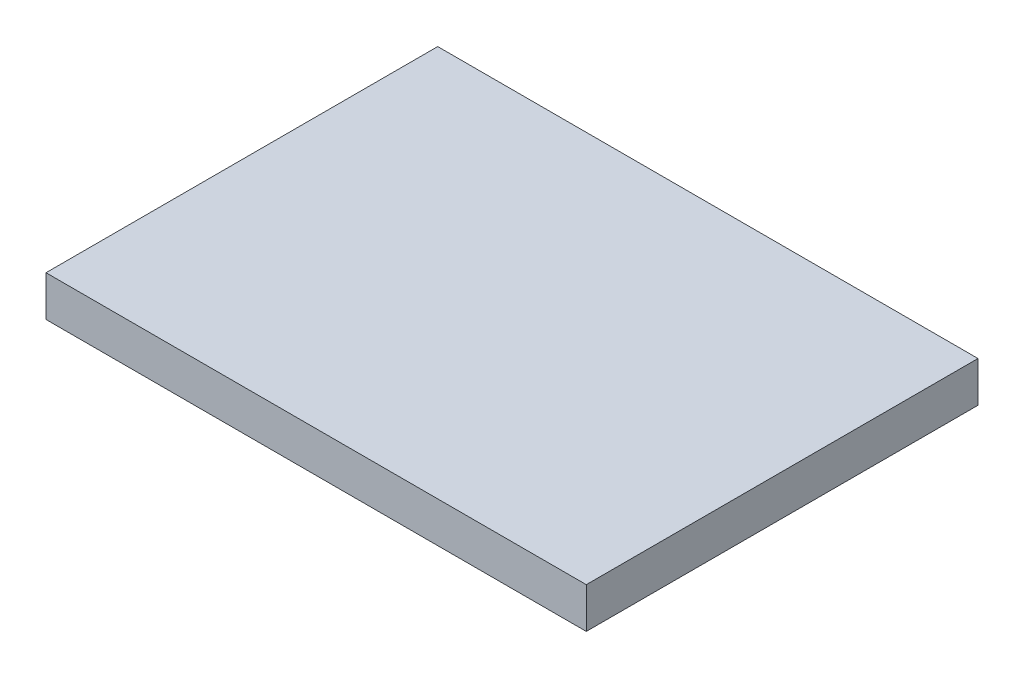
ISO-10303-21;
HEADER;
FILE_DESCRIPTION(('STEP AP214'),'2;1');
FILE_NAME('part.step','',(''),(''),'','','');
FILE_SCHEMA(('AUTOMOTIVE_DESIGN { 1 0 10303 214 1 1 1 1 }'));
ENDSEC;
DATA;
#1=APPLICATION_CONTEXT('core data for automotive mechanical design processes');
#2=APPLICATION_PROTOCOL_DEFINITION('international standard','automotive_design',2000,#1);
#3=PRODUCT_CONTEXT('',#1,'mechanical');
#4=PRODUCT('Part','Part','',(#3));
#5=PRODUCT_RELATED_PRODUCT_CATEGORY('part','',(#4));
#6=PRODUCT_DEFINITION_FORMATION('','',#4);
#7=PRODUCT_DEFINITION_CONTEXT('part definition',#1,'design');
#8=PRODUCT_DEFINITION('design','',#6,#7);
#9=PRODUCT_DEFINITION_SHAPE('','',#8);
#10=(LENGTH_UNIT() NAMED_UNIT(*) SI_UNIT(.MILLI.,.METRE.));
#11=(NAMED_UNIT(*) PLANE_ANGLE_UNIT() SI_UNIT($,.RADIAN.));
#12=(NAMED_UNIT(*) SI_UNIT($,.STERADIAN.) SOLID_ANGLE_UNIT());
#13=UNCERTAINTY_MEASURE_WITH_UNIT(LENGTH_MEASURE(1.E-05),#10,'distance_accuracy_value','');
#14=(GEOMETRIC_REPRESENTATION_CONTEXT(3) GLOBAL_UNCERTAINTY_ASSIGNED_CONTEXT((#13)) GLOBAL_UNIT_ASSIGNED_CONTEXT((#10,
#11,#12)) REPRESENTATION_CONTEXT('',''));
#15=CARTESIAN_POINT('',(0.,0.,0.));
#16=DIRECTION('',(0.,0.,1.));
#17=DIRECTION('',(1.,0.,0.));
#18=AXIS2_PLACEMENT_3D('',#15,#16,#17);
#19=CARTESIAN_POINT('',(-40.,6.,-29.));
#20=DIRECTION('',(0.,0.,-1.));
#21=DIRECTION('',(-1.,0.,0.));
#22=AXIS2_PLACEMENT_3D('',#19,#20,#21);
#23=PLANE('',#22);
#24=DIRECTION('',(1.,0.,0.));
#25=VECTOR('',#24,1.);
#26=CARTESIAN_POINT('',(-40.,0.,-29.));
#27=LINE('',#26,#25);
#28=CARTESIAN_POINT('',(-40.,0.,-29.));
#29=VERTEX_POINT('',#28);
#30=CARTESIAN_POINT('',(40.,0.,-29.));
#31=VERTEX_POINT('',#30);
#32=EDGE_CURVE('E101',#29,#31,#27,.T.);
#33=ORIENTED_EDGE('',*,*,#32,.F.);
#34=DIRECTION('',(0.,-1.,0.));
#35=VECTOR('',#34,1.);
#36=CARTESIAN_POINT('',(-40.,6.,-29.));
#37=LINE('',#36,#35);
#38=CARTESIAN_POINT('',(-40.,6.,-29.));
#39=VERTEX_POINT('',#38);
#40=EDGE_CURVE('E11',#39,#29,#37,.T.);
#41=ORIENTED_EDGE('',*,*,#40,.F.);
#42=DIRECTION('',(1.,0.,0.));
#43=VECTOR('',#42,1.);
#44=CARTESIAN_POINT('',(-40.,6.,-29.));
#45=LINE('',#44,#43);
#46=CARTESIAN_POINT('',(40.,6.,-29.));
#47=VERTEX_POINT('',#46);
#48=EDGE_CURVE('E96',#39,#47,#45,.T.);
#49=ORIENTED_EDGE('',*,*,#48,.T.);
#50=DIRECTION('',(0.,-1.,0.));
#51=VECTOR('',#50,1.);
#52=CARTESIAN_POINT('',(40.,6.,-29.));
#53=LINE('',#52,#51);
#54=EDGE_CURVE('E39',#47,#31,#53,.T.);
#55=ORIENTED_EDGE('',*,*,#54,.T.);
#56=EDGE_LOOP('',(#33,#41,#49,#55));
#57=FACE_BOUND('',#56,.T.);
#58=ADVANCED_FACE('F36',(#57),#23,.T.);
#59=CARTESIAN_POINT('',(-40.,6.,-29.));
#60=DIRECTION('',(1.,0.,0.));
#61=DIRECTION('',(0.,0.,-1.));
#62=AXIS2_PLACEMENT_3D('',#59,#60,#61);
#63=PLANE('',#62);
#64=DIRECTION('',(0.,0.,1.));
#65=VECTOR('',#64,1.);
#66=CARTESIAN_POINT('',(-40.,0.,-29.));
#67=LINE('',#66,#65);
#68=CARTESIAN_POINT('',(-40.,0.,29.));
#69=VERTEX_POINT('',#68);
#70=EDGE_CURVE('E69',#29,#69,#67,.T.);
#71=ORIENTED_EDGE('',*,*,#70,.T.);
#72=DIRECTION('',(0.,-1.,0.));
#73=VECTOR('',#72,1.);
#74=CARTESIAN_POINT('',(-40.,6.,29.));
#75=LINE('',#74,#73);
#76=CARTESIAN_POINT('',(-40.,6.,29.));
#77=VERTEX_POINT('',#76);
#78=EDGE_CURVE('E45',#77,#69,#75,.T.);
#79=ORIENTED_EDGE('',*,*,#78,.F.);
#80=DIRECTION('',(0.,0.,1.));
#81=VECTOR('',#80,1.);
#82=CARTESIAN_POINT('',(-40.,6.,-29.));
#83=LINE('',#82,#81);
#84=EDGE_CURVE('E86',#39,#77,#83,.T.);
#85=ORIENTED_EDGE('',*,*,#84,.F.);
#86=ORIENTED_EDGE('',*,*,#40,.T.);
#87=EDGE_LOOP('',(#71,#79,#85,#86));
#88=FACE_BOUND('',#87,.T.);
#89=ADVANCED_FACE('F111',(#88),#63,.F.);
#90=CARTESIAN_POINT('',(-40.,6.,29.));
#91=DIRECTION('',(0.,0.,-1.));
#92=DIRECTION('',(-1.,0.,0.));
#93=AXIS2_PLACEMENT_3D('',#90,#91,#92);
#94=PLANE('',#93);
#95=DIRECTION('',(1.,0.,0.));
#96=VECTOR('',#95,1.);
#97=CARTESIAN_POINT('',(-40.,0.,29.));
#98=LINE('',#97,#96);
#99=CARTESIAN_POINT('',(40.,0.,29.));
#100=VERTEX_POINT('',#99);
#101=EDGE_CURVE('E93',#69,#100,#98,.T.);
#102=ORIENTED_EDGE('',*,*,#101,.T.);
#103=DIRECTION('',(0.,-1.,0.));
#104=VECTOR('',#103,1.);
#105=CARTESIAN_POINT('',(40.,6.,29.));
#106=LINE('',#105,#104);
#107=CARTESIAN_POINT('',(40.,6.,29.));
#108=VERTEX_POINT('',#107);
#109=EDGE_CURVE('E90',#108,#100,#106,.T.);
#110=ORIENTED_EDGE('',*,*,#109,.F.);
#111=DIRECTION('',(1.,0.,0.));
#112=VECTOR('',#111,1.);
#113=CARTESIAN_POINT('',(-40.,6.,29.));
#114=LINE('',#113,#112);
#115=EDGE_CURVE('E81',#77,#108,#114,.T.);
#116=ORIENTED_EDGE('',*,*,#115,.F.);
#117=ORIENTED_EDGE('',*,*,#78,.T.);
#118=EDGE_LOOP('',(#102,#110,#116,#117));
#119=FACE_BOUND('',#118,.T.);
#120=ADVANCED_FACE('F91',(#119),#94,.F.);
#121=CARTESIAN_POINT('',(40.,6.,-29.));
#122=DIRECTION('',(1.,0.,0.));
#123=DIRECTION('',(0.,0.,-1.));
#124=AXIS2_PLACEMENT_3D('',#121,#122,#123);
#125=PLANE('',#124);
#126=DIRECTION('',(0.,0.,1.));
#127=VECTOR('',#126,1.);
#128=CARTESIAN_POINT('',(40.,0.,-29.));
#129=LINE('',#128,#127);
#130=EDGE_CURVE('E104',#31,#100,#129,.T.);
#131=ORIENTED_EDGE('',*,*,#130,.F.);
#132=ORIENTED_EDGE('',*,*,#54,.F.);
#133=DIRECTION('',(0.,0.,1.));
#134=VECTOR('',#133,1.);
#135=CARTESIAN_POINT('',(40.,6.,-29.));
#136=LINE('',#135,#134);
#137=EDGE_CURVE('E85',#47,#108,#136,.T.);
#138=ORIENTED_EDGE('',*,*,#137,.T.);
#139=ORIENTED_EDGE('',*,*,#109,.T.);
#140=EDGE_LOOP('',(#131,#132,#138,#139));
#141=FACE_BOUND('',#140,.T.);
#142=ADVANCED_FACE('F95',(#141),#125,.T.);
#143=CARTESIAN_POINT('',(0.,6.,0.));
#144=DIRECTION('',(0.,-1.,0.));
#145=DIRECTION('',(0.,0.,-1.));
#146=AXIS2_PLACEMENT_3D('',#143,#144,#145);
#147=PLANE('',#146);
#148=ORIENTED_EDGE('',*,*,#48,.F.);
#149=ORIENTED_EDGE('',*,*,#84,.T.);
#150=ORIENTED_EDGE('',*,*,#115,.T.);
#151=ORIENTED_EDGE('',*,*,#137,.F.);
#152=EDGE_LOOP('',(#148,#149,#150,#151));
#153=FACE_BOUND('',#152,.T.);
#154=ADVANCED_FACE('F84',(#153),#147,.F.);
#155=CARTESIAN_POINT('',(0.,0.,0.));
#156=DIRECTION('',(0.,-1.,0.));
#157=DIRECTION('',(0.,0.,-1.));
#158=AXIS2_PLACEMENT_3D('',#155,#156,#157);
#159=PLANE('',#158);
#160=ORIENTED_EDGE('',*,*,#32,.T.);
#161=ORIENTED_EDGE('',*,*,#130,.T.);
#162=ORIENTED_EDGE('',*,*,#101,.F.);
#163=ORIENTED_EDGE('',*,*,#70,.F.);
#164=EDGE_LOOP('',(#160,#161,#162,#163));
#165=FACE_BOUND('',#164,.T.);
#166=ADVANCED_FACE('F109',(#165),#159,.T.);
#167=CLOSED_SHELL('',(#58,#89,#120,#142,#154,#166));
#168=MANIFOLD_SOLID_BREP('B2',#167);
#169=ADVANCED_BREP_SHAPE_REPRESENTATION('',(#18,#168),#14);
#170=SHAPE_DEFINITION_REPRESENTATION(#9,#169);
ENDSEC;
END-ISO-10303-21;
